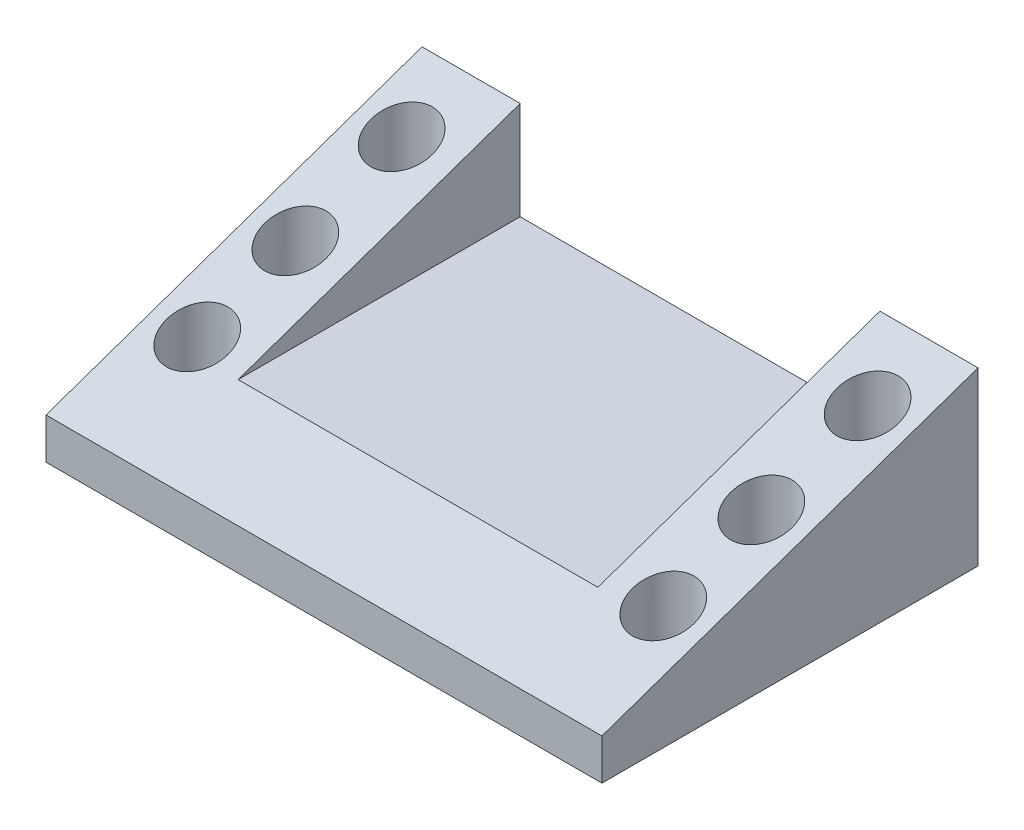
ISO-10303-21;
HEADER;
FILE_DESCRIPTION(('STEP AP214'),'2;1');
FILE_NAME('part.step','',(''),(''),'','','');
FILE_SCHEMA(('AUTOMOTIVE_DESIGN { 1 0 10303 214 1 1 1 1 }'));
ENDSEC;
DATA;
#1=APPLICATION_CONTEXT('core data for automotive mechanical design processes');
#2=APPLICATION_PROTOCOL_DEFINITION('international standard','automotive_design',2000,#1);
#3=PRODUCT_CONTEXT('',#1,'mechanical');
#4=PRODUCT('Part','Part','',(#3));
#5=PRODUCT_RELATED_PRODUCT_CATEGORY('part','',(#4));
#6=PRODUCT_DEFINITION_FORMATION('','',#4);
#7=PRODUCT_DEFINITION_CONTEXT('part definition',#1,'design');
#8=PRODUCT_DEFINITION('design','',#6,#7);
#9=PRODUCT_DEFINITION_SHAPE('','',#8);
#10=(LENGTH_UNIT() NAMED_UNIT(*) SI_UNIT(.MILLI.,.METRE.));
#11=(NAMED_UNIT(*) PLANE_ANGLE_UNIT() SI_UNIT($,.RADIAN.));
#12=(NAMED_UNIT(*) SI_UNIT($,.STERADIAN.) SOLID_ANGLE_UNIT());
#13=UNCERTAINTY_MEASURE_WITH_UNIT(LENGTH_MEASURE(1.E-05),#10,'distance_accuracy_value','');
#14=(GEOMETRIC_REPRESENTATION_CONTEXT(3) GLOBAL_UNCERTAINTY_ASSIGNED_CONTEXT((#13)) GLOBAL_UNIT_ASSIGNED_CONTEXT((#10,
#11,#12)) REPRESENTATION_CONTEXT('',''));
#15=CARTESIAN_POINT('',(0.,0.,0.));
#16=DIRECTION('',(0.,0.,1.));
#17=DIRECTION('',(1.,0.,0.));
#18=AXIS2_PLACEMENT_3D('',#15,#16,#17);
#19=CARTESIAN_POINT('',(34.,67.,23.));
#20=DIRECTION('',(-1.,0.,0.));
#21=DIRECTION('',(0.,0.,1.));
#22=AXIS2_PLACEMENT_3D('',#19,#20,#21);
#23=PLANE('',#22);
#24=DIRECTION('',(0.,-1.,0.));
#25=VECTOR('',#24,1.);
#26=CARTESIAN_POINT('',(34.,67.,-23.));
#27=LINE('',#26,#25);
#28=CARTESIAN_POINT('',(34.,21.,-23.));
#29=VERTEX_POINT('',#28);
#30=CARTESIAN_POINT('',(34.,0.,-23.));
#31=VERTEX_POINT('',#30);
#32=EDGE_CURVE('E49',#29,#31,#27,.T.);
#33=ORIENTED_EDGE('',*,*,#32,.F.);
#34=DIRECTION('',(0.,0.328520624941273,-0.944496796706159));
#35=VECTOR('',#34,1.);
#36=CARTESIAN_POINT('',(34.,5.,23.));
#37=LINE('',#36,#35);
#38=CARTESIAN_POINT('',(34.,5.,23.));
#39=VERTEX_POINT('',#38);
#40=EDGE_CURVE('E101',#39,#29,#37,.T.);
#41=ORIENTED_EDGE('',*,*,#40,.F.);
#42=DIRECTION('',(0.,-1.,0.));
#43=VECTOR('',#42,1.);
#44=CARTESIAN_POINT('',(34.,67.,23.));
#45=LINE('',#44,#43);
#46=CARTESIAN_POINT('',(34.,0.,23.));
#47=VERTEX_POINT('',#46);
#48=EDGE_CURVE('E63',#39,#47,#45,.T.);
#49=ORIENTED_EDGE('',*,*,#48,.T.);
#50=DIRECTION('',(0.,0.,-1.));
#51=VECTOR('',#50,1.);
#52=CARTESIAN_POINT('',(34.,0.,23.));
#53=LINE('',#52,#51);
#54=EDGE_CURVE('E139',#47,#31,#53,.T.);
#55=ORIENTED_EDGE('',*,*,#54,.T.);
#56=EDGE_LOOP('',(#33,#41,#49,#55));
#57=FACE_BOUND('',#56,.T.);
#58=ADVANCED_FACE('F41',(#57),#23,.F.);
#59=CARTESIAN_POINT('',(-34.,67.,-23.));
#60=DIRECTION('',(0.,0.,1.));
#61=DIRECTION('',(1.,0.,0.));
#62=AXIS2_PLACEMENT_3D('',#59,#60,#61);
#63=PLANE('',#62);
#64=DIRECTION('',(0.,-1.,0.));
#65=VECTOR('',#64,1.);
#66=CARTESIAN_POINT('',(-34.,67.,-23.));
#67=LINE('',#66,#65);
#68=CARTESIAN_POINT('',(-34.,21.,-23.));
#69=VERTEX_POINT('',#68);
#70=CARTESIAN_POINT('',(-34.,0.,-23.));
#71=VERTEX_POINT('',#70);
#72=EDGE_CURVE('E121',#69,#71,#67,.T.);
#73=ORIENTED_EDGE('',*,*,#72,.F.);
#74=DIRECTION('',(1.,0.,0.));
#75=VECTOR('',#74,1.);
#76=CARTESIAN_POINT('',(-111.201036262475,21.,-23.));
#77=LINE('',#76,#75);
#78=CARTESIAN_POINT('',(-22.,21.,-23.));
#79=VERTEX_POINT('',#78);
#80=EDGE_CURVE('E155',#69,#79,#77,.T.);
#81=ORIENTED_EDGE('',*,*,#80,.T.);
#82=DIRECTION('',(0.,1.,0.));
#83=VECTOR('',#82,1.);
#84=CARTESIAN_POINT('',(-22.,-63.6553218513582,-23.));
#85=LINE('',#84,#83);
#86=CARTESIAN_POINT('',(-22.,9.00000000000001,-23.));
#87=VERTEX_POINT('',#86);
#88=EDGE_CURVE('E158',#87,#79,#85,.T.);
#89=ORIENTED_EDGE('',*,*,#88,.F.);
#90=DIRECTION('',(-1.,0.,0.));
#91=VECTOR('',#90,1.);
#92=CARTESIAN_POINT('',(-22.,9.00000000000001,-23.));
#93=LINE('',#92,#91);
#94=CARTESIAN_POINT('',(22.,9.00000000000001,-23.));
#95=VERTEX_POINT('',#94);
#96=EDGE_CURVE('E169',#95,#87,#93,.T.);
#97=ORIENTED_EDGE('',*,*,#96,.F.);
#98=DIRECTION('',(0.,1.,0.));
#99=VECTOR('',#98,1.);
#100=CARTESIAN_POINT('',(22.,-63.6553218513582,-23.));
#101=LINE('',#100,#99);
#102=CARTESIAN_POINT('',(22.,21.,-23.));
#103=VERTEX_POINT('',#102);
#104=EDGE_CURVE('E144',#95,#103,#101,.T.);
#105=ORIENTED_EDGE('',*,*,#104,.T.);
#106=EDGE_CURVE('E56',#103,#29,#77,.T.);
#107=ORIENTED_EDGE('',*,*,#106,.T.);
#108=ORIENTED_EDGE('',*,*,#32,.T.);
#109=DIRECTION('',(-1.,0.,0.));
#110=VECTOR('',#109,1.);
#111=CARTESIAN_POINT('',(-34.,0.,-23.));
#112=LINE('',#111,#110);
#113=EDGE_CURVE('E134',#31,#71,#112,.T.);
#114=ORIENTED_EDGE('',*,*,#113,.T.);
#115=EDGE_LOOP('',(#73,#81,#89,#97,#105,#107,#108,#114));
#116=FACE_BOUND('',#115,.T.);
#117=ADVANCED_FACE('F133',(#116),#63,.F.);
#118=CARTESIAN_POINT('',(-34.,67.,23.));
#119=DIRECTION('',(1.,0.,0.));
#120=DIRECTION('',(0.,0.,-1.));
#121=AXIS2_PLACEMENT_3D('',#118,#119,#120);
#122=PLANE('',#121);
#123=DIRECTION('',(0.,-1.,0.));
#124=VECTOR('',#123,1.);
#125=CARTESIAN_POINT('',(-34.,67.,23.));
#126=LINE('',#125,#124);
#127=CARTESIAN_POINT('',(-34.,5.,23.));
#128=VERTEX_POINT('',#127);
#129=CARTESIAN_POINT('',(-34.,0.,23.));
#130=VERTEX_POINT('',#129);
#131=EDGE_CURVE('E117',#128,#130,#126,.T.);
#132=ORIENTED_EDGE('',*,*,#131,.F.);
#133=DIRECTION('',(0.,-0.328520624941273,0.944496796706159));
#134=VECTOR('',#133,1.);
#135=CARTESIAN_POINT('',(-34.,5.,23.));
#136=LINE('',#135,#134);
#137=EDGE_CURVE('E103',#69,#128,#136,.T.);
#138=ORIENTED_EDGE('',*,*,#137,.F.);
#139=ORIENTED_EDGE('',*,*,#72,.T.);
#140=DIRECTION('',(0.,0.,1.));
#141=VECTOR('',#140,1.);
#142=CARTESIAN_POINT('',(-34.,0.,23.));
#143=LINE('',#142,#141);
#144=EDGE_CURVE('E123',#71,#130,#143,.T.);
#145=ORIENTED_EDGE('',*,*,#144,.T.);
#146=EDGE_LOOP('',(#132,#138,#139,#145));
#147=FACE_BOUND('',#146,.T.);
#148=ADVANCED_FACE('F152',(#147),#122,.F.);
#149=CARTESIAN_POINT('',(-34.,67.,23.));
#150=DIRECTION('',(0.,0.,-1.));
#151=DIRECTION('',(-1.,0.,0.));
#152=AXIS2_PLACEMENT_3D('',#149,#150,#151);
#153=PLANE('',#152);
#154=ORIENTED_EDGE('',*,*,#48,.F.);
#155=DIRECTION('',(1.,0.,0.));
#156=VECTOR('',#155,1.);
#157=CARTESIAN_POINT('',(-111.201036262475,5.,23.));
#158=LINE('',#157,#156);
#159=EDGE_CURVE('E99',#128,#39,#158,.T.);
#160=ORIENTED_EDGE('',*,*,#159,.F.);
#161=ORIENTED_EDGE('',*,*,#131,.T.);
#162=DIRECTION('',(1.,0.,0.));
#163=VECTOR('',#162,1.);
#164=CARTESIAN_POINT('',(-34.,0.,23.));
#165=LINE('',#164,#163);
#166=EDGE_CURVE('E114',#130,#47,#165,.T.);
#167=ORIENTED_EDGE('',*,*,#166,.T.);
#168=EDGE_LOOP('',(#154,#160,#161,#167));
#169=FACE_BOUND('',#168,.T.);
#170=ADVANCED_FACE('F112',(#169),#153,.F.);
#171=CARTESIAN_POINT('',(0.,0.,0.));
#172=DIRECTION('',(0.,-1.,0.));
#173=DIRECTION('',(0.,0.,-1.));
#174=AXIS2_PLACEMENT_3D('',#171,#172,#173);
#175=PLANE('',#174);
#176=CARTESIAN_POINT('',(28.5,0.,-2.));
#177=DIRECTION('',(0.,-1.,0.));
#178=DIRECTION('',(0.,0.,-1.));
#179=AXIS2_PLACEMENT_3D('',#176,#177,#178);
#180=CIRCLE('',#179,3.75);
#181=CARTESIAN_POINT('',(28.5,0.,-5.75));
#182=VERTEX_POINT('',#181);
#183=EDGE_CURVE('E215',#182,#182,#180,.T.);
#184=ORIENTED_EDGE('',*,*,#183,.F.);
#185=EDGE_LOOP('',(#184));
#186=FACE_BOUND('',#185,.T.);
#187=CARTESIAN_POINT('',(28.5,0.,10.));
#188=DIRECTION('',(0.,-1.,0.));
#189=DIRECTION('',(0.,0.,-1.));
#190=AXIS2_PLACEMENT_3D('',#187,#188,#189);
#191=CIRCLE('',#190,3.75);
#192=CARTESIAN_POINT('',(28.5,0.,6.25));
#193=VERTEX_POINT('',#192);
#194=EDGE_CURVE('E207',#193,#193,#191,.T.);
#195=ORIENTED_EDGE('',*,*,#194,.F.);
#196=EDGE_LOOP('',(#195));
#197=FACE_BOUND('',#196,.T.);
#198=CARTESIAN_POINT('',(-28.5,0.,-15.));
#199=DIRECTION('',(0.,-1.,0.));
#200=DIRECTION('',(0.,0.,-1.));
#201=AXIS2_PLACEMENT_3D('',#198,#199,#200);
#202=CIRCLE('',#201,3.75);
#203=CARTESIAN_POINT('',(-28.5,0.,-18.75));
#204=VERTEX_POINT('',#203);
#205=EDGE_CURVE('E197',#204,#204,#202,.T.);
#206=ORIENTED_EDGE('',*,*,#205,.F.);
#207=EDGE_LOOP('',(#206));
#208=FACE_BOUND('',#207,.T.);
#209=CARTESIAN_POINT('',(-28.5,0.,-2.));
#210=DIRECTION('',(0.,-1.,0.));
#211=DIRECTION('',(0.,0.,-1.));
#212=AXIS2_PLACEMENT_3D('',#209,#210,#211);
#213=CIRCLE('',#212,3.75);
#214=CARTESIAN_POINT('',(-28.5,0.,-5.75));
#215=VERTEX_POINT('',#214);
#216=EDGE_CURVE('E198',#215,#215,#213,.T.);
#217=ORIENTED_EDGE('',*,*,#216,.F.);
#218=EDGE_LOOP('',(#217));
#219=FACE_BOUND('',#218,.T.);
#220=CARTESIAN_POINT('',(-28.5,0.,10.));
#221=DIRECTION('',(0.,-1.,0.));
#222=DIRECTION('',(0.,0.,-1.));
#223=AXIS2_PLACEMENT_3D('',#220,#221,#222);
#224=CIRCLE('',#223,3.75000000000001);
#225=CARTESIAN_POINT('',(-28.5,0.,6.24999999999999));
#226=VERTEX_POINT('',#225);
#227=EDGE_CURVE('E228',#226,#226,#224,.T.);
#228=ORIENTED_EDGE('',*,*,#227,.F.);
#229=EDGE_LOOP('',(#228));
#230=FACE_BOUND('',#229,.T.);
#231=CARTESIAN_POINT('',(28.5,0.,-15.));
#232=DIRECTION('',(0.,-1.,0.));
#233=DIRECTION('',(0.,0.,-1.));
#234=AXIS2_PLACEMENT_3D('',#231,#232,#233);
#235=CIRCLE('',#234,3.75);
#236=CARTESIAN_POINT('',(28.5,0.,-18.75));
#237=VERTEX_POINT('',#236);
#238=EDGE_CURVE('E188',#237,#237,#235,.T.);
#239=ORIENTED_EDGE('',*,*,#238,.F.);
#240=EDGE_LOOP('',(#239));
#241=FACE_BOUND('',#240,.T.);
#242=ORIENTED_EDGE('',*,*,#54,.F.);
#243=ORIENTED_EDGE('',*,*,#166,.F.);
#244=ORIENTED_EDGE('',*,*,#144,.F.);
#245=ORIENTED_EDGE('',*,*,#113,.F.);
#246=EDGE_LOOP('',(#242,#243,#244,#245));
#247=FACE_BOUND('',#246,.T.);
#248=ADVANCED_FACE('F138',(#186,#197,#208,#219,#230,#241,#247),#175,.T.);
#249=CARTESIAN_POINT('',(0.,9.,0.));
#250=DIRECTION('',(0.,-1.,0.));
#251=DIRECTION('',(0.,0.,-1.));
#252=AXIS2_PLACEMENT_3D('',#249,#250,#251);
#253=PLANE('',#252);
#254=DIRECTION('',(0.,0.,1.));
#255=VECTOR('',#254,1.);
#256=CARTESIAN_POINT('',(-22.,9.00000000000001,23.));
#257=LINE('',#256,#255);
#258=CARTESIAN_POINT('',(-22.,9.,11.5));
#259=VERTEX_POINT('',#258);
#260=EDGE_CURVE('E166',#87,#259,#257,.T.);
#261=ORIENTED_EDGE('',*,*,#260,.T.);
#262=DIRECTION('',(1.,0.,0.));
#263=VECTOR('',#262,1.);
#264=CARTESIAN_POINT('',(0.,9.,11.5));
#265=LINE('',#264,#263);
#266=CARTESIAN_POINT('',(22.,9.00000000000001,11.5));
#267=VERTEX_POINT('',#266);
#268=EDGE_CURVE('E179',#259,#267,#265,.T.);
#269=ORIENTED_EDGE('',*,*,#268,.T.);
#270=DIRECTION('',(0.,0.,-1.));
#271=VECTOR('',#270,1.);
#272=CARTESIAN_POINT('',(22.,9.00000000000001,23.));
#273=LINE('',#272,#271);
#274=EDGE_CURVE('E147',#267,#95,#273,.T.);
#275=ORIENTED_EDGE('',*,*,#274,.T.);
#276=ORIENTED_EDGE('',*,*,#96,.T.);
#277=EDGE_LOOP('',(#261,#269,#275,#276));
#278=FACE_BOUND('',#277,.T.);
#279=ADVANCED_FACE('F237',(#278),#253,.F.);
#280=CARTESIAN_POINT('',(-22.,-63.6553218513582,23.));
#281=DIRECTION('',(-1.,0.,0.));
#282=DIRECTION('',(0.,0.,1.));
#283=AXIS2_PLACEMENT_3D('',#280,#281,#282);
#284=PLANE('',#283);
#285=ORIENTED_EDGE('',*,*,#88,.T.);
#286=DIRECTION('',(0.,-0.328520624941273,0.944496796706159));
#287=VECTOR('',#286,1.);
#288=CARTESIAN_POINT('',(-22.,-2.40968060453106,44.3028317380268));
#289=LINE('',#288,#287);
#290=EDGE_CURVE('E164',#79,#259,#289,.T.);
#291=ORIENTED_EDGE('',*,*,#290,.T.);
#292=ORIENTED_EDGE('',*,*,#260,.F.);
#293=EDGE_LOOP('',(#285,#291,#292));
#294=FACE_BOUND('',#293,.T.);
#295=ADVANCED_FACE('F163',(#294),#284,.F.);
#296=CARTESIAN_POINT('',(22.,-63.6553218513582,23.));
#297=DIRECTION('',(1.,0.,0.));
#298=DIRECTION('',(0.,0.,-1.));
#299=AXIS2_PLACEMENT_3D('',#296,#297,#298);
#300=PLANE('',#299);
#301=ORIENTED_EDGE('',*,*,#274,.F.);
#302=DIRECTION('',(0.,0.328520624941273,-0.944496796706159));
#303=VECTOR('',#302,1.);
#304=CARTESIAN_POINT('',(22.,-2.40968060453106,44.3028317380268));
#305=LINE('',#304,#303);
#306=EDGE_CURVE('E12',#267,#103,#305,.T.);
#307=ORIENTED_EDGE('',*,*,#306,.T.);
#308=ORIENTED_EDGE('',*,*,#104,.F.);
#309=EDGE_LOOP('',(#301,#307,#308));
#310=FACE_BOUND('',#309,.T.);
#311=ADVANCED_FACE('F253',(#310),#300,.F.);
#312=CARTESIAN_POINT('',(-111.201036262475,5.,23.));
#313=DIRECTION('',(0.,-0.944496796706159,-0.328520624941273));
#314=DIRECTION('',(0.,0.328520624941273,-0.944496796706159));
#315=AXIS2_PLACEMENT_3D('',#312,#313,#314);
#316=PLANE('',#315);
#317=CARTESIAN_POINT('',(28.5,13.695652173913,-2.));
#318=DIRECTION('',(0.,-0.944496796706159,-0.328520624941273));
#319=DIRECTION('',(0.,-0.328520624941273,0.944496796706159));
#320=AXIS2_PLACEMENT_3D('',#317,#318,#319);
#321=ELLIPSE('',#320,3.97036815061497,3.75);
#322=CARTESIAN_POINT('',(28.5,12.3913043478261,1.75));
#323=VERTEX_POINT('',#322);
#324=EDGE_CURVE('E192',#323,#323,#321,.F.);
#325=ORIENTED_EDGE('',*,*,#324,.F.);
#326=EDGE_LOOP('',(#325));
#327=FACE_BOUND('',#326,.T.);
#328=CARTESIAN_POINT('',(28.5,9.52173913043478,10.));
#329=DIRECTION('',(0.,-0.944496796706159,-0.328520624941273));
#330=DIRECTION('',(0.,-0.328520624941273,0.944496796706159));
#331=AXIS2_PLACEMENT_3D('',#328,#329,#330);
#332=ELLIPSE('',#331,3.97036815061497,3.75);
#333=CARTESIAN_POINT('',(28.5,8.21739130434782,13.75));
#334=VERTEX_POINT('',#333);
#335=EDGE_CURVE('E211',#334,#334,#332,.F.);
#336=ORIENTED_EDGE('',*,*,#335,.F.);
#337=EDGE_LOOP('',(#336));
#338=FACE_BOUND('',#337,.T.);
#339=CARTESIAN_POINT('',(-28.5,18.2173913043478,-15.));
#340=DIRECTION('',(0.,-0.944496796706159,-0.328520624941273));
#341=DIRECTION('',(0.,-0.328520624941273,0.944496796706159));
#342=AXIS2_PLACEMENT_3D('',#339,#340,#341);
#343=ELLIPSE('',#342,3.97036815061498,3.75);
#344=CARTESIAN_POINT('',(-28.5,16.9130434782609,-11.25));
#345=VERTEX_POINT('',#344);
#346=EDGE_CURVE('E203',#345,#345,#343,.F.);
#347=ORIENTED_EDGE('',*,*,#346,.F.);
#348=EDGE_LOOP('',(#347));
#349=FACE_BOUND('',#348,.T.);
#350=CARTESIAN_POINT('',(-28.5,13.695652173913,-2.));
#351=DIRECTION('',(0.,-0.944496796706159,-0.328520624941273));
#352=DIRECTION('',(0.,-0.328520624941273,0.944496796706159));
#353=AXIS2_PLACEMENT_3D('',#350,#351,#352);
#354=ELLIPSE('',#353,3.97036815061498,3.75);
#355=CARTESIAN_POINT('',(-28.5,12.3913043478261,1.75));
#356=VERTEX_POINT('',#355);
#357=EDGE_CURVE('E193',#356,#356,#354,.F.);
#358=ORIENTED_EDGE('',*,*,#357,.F.);
#359=EDGE_LOOP('',(#358));
#360=FACE_BOUND('',#359,.T.);
#361=CARTESIAN_POINT('',(-28.5,9.52173913043478,10.));
#362=DIRECTION('',(0.,-0.944496796706159,-0.328520624941273));
#363=DIRECTION('',(0.,-0.328520624941273,0.944496796706159));
#364=AXIS2_PLACEMENT_3D('',#361,#362,#363);
#365=ELLIPSE('',#364,3.97036815061498,3.75000000000001);
#366=CARTESIAN_POINT('',(-28.5,8.21739130434782,13.75));
#367=VERTEX_POINT('',#366);
#368=EDGE_CURVE('E202',#367,#367,#365,.F.);
#369=ORIENTED_EDGE('',*,*,#368,.F.);
#370=EDGE_LOOP('',(#369));
#371=FACE_BOUND('',#370,.T.);
#372=CARTESIAN_POINT('',(28.5,18.2173913043478,-15.));
#373=DIRECTION('',(0.,-0.944496796706159,-0.328520624941273));
#374=DIRECTION('',(0.,-0.328520624941273,0.944496796706159));
#375=AXIS2_PLACEMENT_3D('',#372,#373,#374);
#376=ELLIPSE('',#375,3.97036815061497,3.75);
#377=CARTESIAN_POINT('',(28.5,16.9130434782609,-11.25));
#378=VERTEX_POINT('',#377);
#379=EDGE_CURVE('E110',#378,#378,#376,.F.);
#380=ORIENTED_EDGE('',*,*,#379,.F.);
#381=EDGE_LOOP('',(#380));
#382=FACE_BOUND('',#381,.T.);
#383=ORIENTED_EDGE('',*,*,#80,.F.);
#384=ORIENTED_EDGE('',*,*,#137,.T.);
#385=ORIENTED_EDGE('',*,*,#159,.T.);
#386=ORIENTED_EDGE('',*,*,#40,.T.);
#387=ORIENTED_EDGE('',*,*,#106,.F.);
#388=ORIENTED_EDGE('',*,*,#306,.F.);
#389=ORIENTED_EDGE('',*,*,#268,.F.);
#390=ORIENTED_EDGE('',*,*,#290,.F.);
#391=EDGE_LOOP('',(#383,#384,#385,#386,#387,#388,#389,#390));
#392=FACE_BOUND('',#391,.T.);
#393=ADVANCED_FACE('F100',(#327,#338,#349,#360,#371,#382,#392),#316,.F.);
#394=CARTESIAN_POINT('',(28.5,29.1356406494608,-15.));
#395=DIRECTION('',(0.,-1.,0.));
#396=DIRECTION('',(0.,0.,-1.));
#397=AXIS2_PLACEMENT_3D('',#394,#395,#396);
#398=CYLINDRICAL_SURFACE('',#397,3.75);
#399=ORIENTED_EDGE('',*,*,#379,.T.);
#400=EDGE_LOOP('',(#399));
#401=FACE_BOUND('',#400,.T.);
#402=ORIENTED_EDGE('',*,*,#238,.T.);
#403=EDGE_LOOP('',(#402));
#404=FACE_BOUND('',#403,.T.);
#405=ADVANCED_FACE('F242',(#401,#404),#398,.F.);
#406=CARTESIAN_POINT('',(-28.5,29.1356406494608,10.));
#407=DIRECTION('',(0.,-1.,0.));
#408=DIRECTION('',(0.,0.,-1.));
#409=AXIS2_PLACEMENT_3D('',#406,#407,#408);
#410=CYLINDRICAL_SURFACE('',#409,3.75000000000001);
#411=ORIENTED_EDGE('',*,*,#368,.T.);
#412=EDGE_LOOP('',(#411));
#413=FACE_BOUND('',#412,.T.);
#414=ORIENTED_EDGE('',*,*,#227,.T.);
#415=EDGE_LOOP('',(#414));
#416=FACE_BOUND('',#415,.T.);
#417=ADVANCED_FACE('F233',(#413,#416),#410,.F.);
#418=CARTESIAN_POINT('',(-28.5,29.1356406494608,-2.));
#419=DIRECTION('',(0.,-1.,0.));
#420=DIRECTION('',(0.,0.,-1.));
#421=AXIS2_PLACEMENT_3D('',#418,#419,#420);
#422=CYLINDRICAL_SURFACE('',#421,3.75);
#423=ORIENTED_EDGE('',*,*,#357,.T.);
#424=EDGE_LOOP('',(#423));
#425=FACE_BOUND('',#424,.T.);
#426=ORIENTED_EDGE('',*,*,#216,.T.);
#427=EDGE_LOOP('',(#426));
#428=FACE_BOUND('',#427,.T.);
#429=ADVANCED_FACE('F250',(#425,#428),#422,.F.);
#430=CARTESIAN_POINT('',(-28.5,29.1356406494608,-15.));
#431=DIRECTION('',(0.,-1.,0.));
#432=DIRECTION('',(0.,0.,-1.));
#433=AXIS2_PLACEMENT_3D('',#430,#431,#432);
#434=CYLINDRICAL_SURFACE('',#433,3.75);
#435=ORIENTED_EDGE('',*,*,#346,.T.);
#436=EDGE_LOOP('',(#435));
#437=FACE_BOUND('',#436,.T.);
#438=ORIENTED_EDGE('',*,*,#205,.T.);
#439=EDGE_LOOP('',(#438));
#440=FACE_BOUND('',#439,.T.);
#441=ADVANCED_FACE('F307',(#437,#440),#434,.F.);
#442=CARTESIAN_POINT('',(28.5,29.1356406494608,10.));
#443=DIRECTION('',(0.,-1.,0.));
#444=DIRECTION('',(0.,0.,-1.));
#445=AXIS2_PLACEMENT_3D('',#442,#443,#444);
#446=CYLINDRICAL_SURFACE('',#445,3.75);
#447=ORIENTED_EDGE('',*,*,#335,.T.);
#448=EDGE_LOOP('',(#447));
#449=FACE_BOUND('',#448,.T.);
#450=ORIENTED_EDGE('',*,*,#194,.T.);
#451=EDGE_LOOP('',(#450));
#452=FACE_BOUND('',#451,.T.);
#453=ADVANCED_FACE('F316',(#449,#452),#446,.F.);
#454=CARTESIAN_POINT('',(28.5,29.1356406494608,-2.));
#455=DIRECTION('',(0.,-1.,0.));
#456=DIRECTION('',(0.,0.,-1.));
#457=AXIS2_PLACEMENT_3D('',#454,#455,#456);
#458=CYLINDRICAL_SURFACE('',#457,3.75);
#459=ORIENTED_EDGE('',*,*,#324,.T.);
#460=EDGE_LOOP('',(#459));
#461=FACE_BOUND('',#460,.T.);
#462=ORIENTED_EDGE('',*,*,#183,.T.);
#463=EDGE_LOOP('',(#462));
#464=FACE_BOUND('',#463,.T.);
#465=ADVANCED_FACE('F326',(#461,#464),#458,.F.);
#466=CLOSED_SHELL('',(#58,#117,#148,#170,#248,#279,#295,#311,#393,#405,#417,#429,#441,#453,#465));
#467=MANIFOLD_SOLID_BREP('B2',#466);
#468=ADVANCED_BREP_SHAPE_REPRESENTATION('',(#18,#467),#14);
#469=SHAPE_DEFINITION_REPRESENTATION(#9,#468);
ENDSEC;
END-ISO-10303-21;
